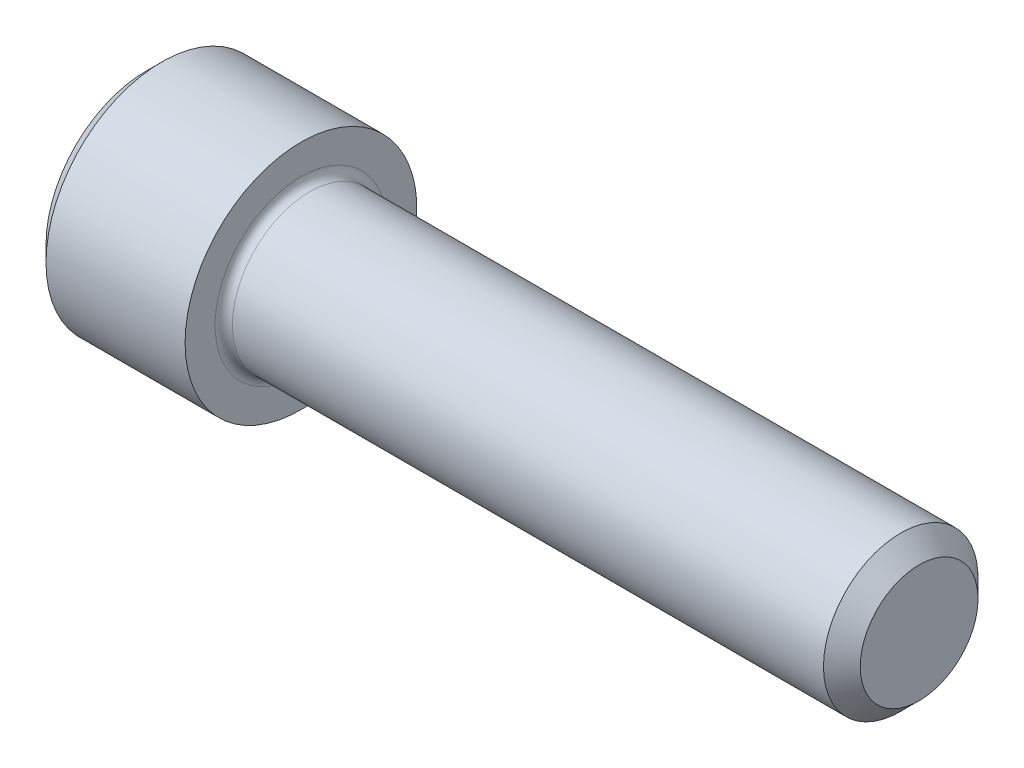
ISO-10303-21;
HEADER;
FILE_DESCRIPTION(('STEP AP214'),'2;1');
FILE_NAME('part.step','',(''),(''),'','','');
FILE_SCHEMA(('AUTOMOTIVE_DESIGN { 1 0 10303 214 1 1 1 1 }'));
ENDSEC;
DATA;
#1=APPLICATION_CONTEXT('core data for automotive mechanical design processes');
#2=APPLICATION_PROTOCOL_DEFINITION('international standard','automotive_design',2000,#1);
#3=PRODUCT_CONTEXT('',#1,'mechanical');
#4=PRODUCT('Part','Part','',(#3));
#5=PRODUCT_RELATED_PRODUCT_CATEGORY('part','',(#4));
#6=PRODUCT_DEFINITION_FORMATION('','',#4);
#7=PRODUCT_DEFINITION_CONTEXT('part definition',#1,'design');
#8=PRODUCT_DEFINITION('design','',#6,#7);
#9=PRODUCT_DEFINITION_SHAPE('','',#8);
#10=(LENGTH_UNIT() NAMED_UNIT(*) SI_UNIT(.MILLI.,.METRE.));
#11=(NAMED_UNIT(*) PLANE_ANGLE_UNIT() SI_UNIT($,.RADIAN.));
#12=(NAMED_UNIT(*) SI_UNIT($,.STERADIAN.) SOLID_ANGLE_UNIT());
#13=UNCERTAINTY_MEASURE_WITH_UNIT(LENGTH_MEASURE(1.E-05),#10,'distance_accuracy_value','');
#14=(GEOMETRIC_REPRESENTATION_CONTEXT(3) GLOBAL_UNCERTAINTY_ASSIGNED_CONTEXT((#13)) GLOBAL_UNIT_ASSIGNED_CONTEXT((#10,
#11,#12)) REPRESENTATION_CONTEXT('',''));
#15=CARTESIAN_POINT('',(0.,0.,0.));
#16=DIRECTION('',(0.,0.,1.));
#17=DIRECTION('',(1.,0.,0.));
#18=AXIS2_PLACEMENT_3D('',#15,#16,#17);
#19=CARTESIAN_POINT('',(0.,0.,0.));
#20=DIRECTION('',(-1.,0.,0.));
#21=DIRECTION('',(0.,0.,1.));
#22=AXIS2_PLACEMENT_3D('',#19,#20,#21);
#23=PLANE('',#22);
#24=DIRECTION('',(0.,-0.499999999999999,0.866025403784439));
#25=VECTOR('',#24,1.);
#26=CARTESIAN_POINT('',(0.,2.7496306570156,0.));
#27=LINE('',#26,#25);
#28=CARTESIAN_POINT('',(0.,2.7496306570156,0.));
#29=VERTEX_POINT('',#28);
#30=CARTESIAN_POINT('',(0.,1.3748153285078,2.38125));
#31=VERTEX_POINT('',#30);
#32=EDGE_CURVE('E387',#29,#31,#27,.T.);
#33=ORIENTED_EDGE('',*,*,#32,.T.);
#34=DIRECTION('',(0.,1.,0.));
#35=VECTOR('',#34,1.);
#36=CARTESIAN_POINT('',(0.,-1.37481532850779,2.38125));
#37=LINE('',#36,#35);
#38=CARTESIAN_POINT('',(0.,-1.37481532850779,2.38125));
#39=VERTEX_POINT('',#38);
#40=EDGE_CURVE('E131',#39,#31,#37,.T.);
#41=ORIENTED_EDGE('',*,*,#40,.F.);
#42=DIRECTION('',(0.,-0.500000000000001,-0.866025403784438));
#43=VECTOR('',#42,1.);
#44=CARTESIAN_POINT('',(0.,-1.37481532850779,2.38125));
#45=LINE('',#44,#43);
#46=CARTESIAN_POINT('',(0.,-2.74963065701559,0.));
#47=VERTEX_POINT('',#46);
#48=EDGE_CURVE('E390',#39,#47,#45,.T.);
#49=ORIENTED_EDGE('',*,*,#48,.T.);
#50=DIRECTION('',(0.,0.499999999999998,-0.86602540378444));
#51=VECTOR('',#50,1.);
#52=CARTESIAN_POINT('',(0.,-2.74963065701559,0.));
#53=LINE('',#52,#51);
#54=CARTESIAN_POINT('',(0.,-1.3748153285078,-2.38125));
#55=VERTEX_POINT('',#54);
#56=EDGE_CURVE('E393',#47,#55,#53,.T.);
#57=ORIENTED_EDGE('',*,*,#56,.T.);
#58=DIRECTION('',(0.,-1.,0.));
#59=VECTOR('',#58,1.);
#60=CARTESIAN_POINT('',(0.,1.3748153285078,-2.38125));
#61=LINE('',#60,#59);
#62=CARTESIAN_POINT('',(0.,1.3748153285078,-2.38125));
#63=VERTEX_POINT('',#62);
#64=EDGE_CURVE('E396',#63,#55,#61,.T.);
#65=ORIENTED_EDGE('',*,*,#64,.F.);
#66=DIRECTION('',(0.,-0.500000000000001,-0.866025403784438));
#67=VECTOR('',#66,1.);
#68=CARTESIAN_POINT('',(0.,2.7496306570156,0.));
#69=LINE('',#68,#67);
#70=EDGE_CURVE('E126',#29,#63,#69,.T.);
#71=ORIENTED_EDGE('',*,*,#70,.F.);
#72=EDGE_LOOP('',(#33,#41,#49,#57,#65,#71));
#73=FACE_BOUND('',#72,.T.);
#74=CARTESIAN_POINT('',(0.,0.,0.));
#75=DIRECTION('',(-1.,0.,0.));
#76=DIRECTION('',(0.,0.,1.));
#77=AXIS2_PLACEMENT_3D('',#74,#75,#76);
#78=CIRCLE('',#77,4.1275);
#79=CARTESIAN_POINT('',(0.,0.,4.1275));
#80=VERTEX_POINT('',#79);
#81=EDGE_CURVE('E142',#80,#80,#78,.T.);
#82=ORIENTED_EDGE('',*,*,#81,.T.);
#83=EDGE_LOOP('',(#82));
#84=FACE_BOUND('',#83,.T.);
#85=ADVANCED_FACE('F35',(#73,#84),#23,.T.);
#86=CARTESIAN_POINT('',(31.75,2.41935,0.));
#87=DIRECTION('',(1.,0.,0.));
#88=DIRECTION('',(0.,0.,-1.));
#89=AXIS2_PLACEMENT_3D('',#86,#87,#88);
#90=PLANE('',#89);
#91=CARTESIAN_POINT('',(31.75,0.,0.));
#92=DIRECTION('',(-1.,0.,0.));
#93=DIRECTION('',(0.,0.,1.));
#94=AXIS2_PLACEMENT_3D('',#91,#92,#93);
#95=CIRCLE('',#94,2.41935);
#96=CARTESIAN_POINT('',(31.75,0.,2.41935));
#97=VERTEX_POINT('',#96);
#98=EDGE_CURVE('E155',#97,#97,#95,.T.);
#99=ORIENTED_EDGE('',*,*,#98,.F.);
#100=EDGE_LOOP('',(#99));
#101=FACE_BOUND('',#100,.T.);
#102=ADVANCED_FACE('F176',(#101),#90,.T.);
#103=CARTESIAN_POINT('',(31.75,0.,0.));
#104=DIRECTION('',(-1.,0.,0.));
#105=DIRECTION('',(0.,0.,1.));
#106=AXIS2_PLACEMENT_3D('',#103,#104,#105);
#107=CONICAL_SURFACE('',#106,2.41935,0.785398163397218);
#108=CARTESIAN_POINT('',(30.9943499999998,0.,0.));
#109=DIRECTION('',(-1.,0.,0.));
#110=DIRECTION('',(0.,0.,1.));
#111=AXIS2_PLACEMENT_3D('',#108,#109,#110);
#112=CIRCLE('',#111,3.17499999999981);
#113=CARTESIAN_POINT('',(30.9943499999998,0.,3.17499999999981));
#114=VERTEX_POINT('',#113);
#115=EDGE_CURVE('E152',#114,#114,#112,.T.);
#116=ORIENTED_EDGE('',*,*,#115,.F.);
#117=EDGE_LOOP('',(#116));
#118=FACE_BOUND('',#117,.T.);
#119=ORIENTED_EDGE('',*,*,#98,.T.);
#120=EDGE_LOOP('',(#119));
#121=FACE_BOUND('',#120,.T.);
#122=ADVANCED_FACE('F182',(#118,#121),#107,.T.);
#123=CARTESIAN_POINT('',(-31.75,0.,0.));
#124=DIRECTION('',(-1.,0.,0.));
#125=DIRECTION('',(0.,0.,1.));
#126=AXIS2_PLACEMENT_3D('',#123,#124,#125);
#127=CYLINDRICAL_SURFACE('',#126,3.17499999999991);
#128=CARTESIAN_POINT('',(6.7056,0.,0.));
#129=DIRECTION('',(1.,0.,0.));
#130=DIRECTION('',(0.,0.,-1.));
#131=AXIS2_PLACEMENT_3D('',#128,#129,#130);
#132=CIRCLE('',#131,3.17499999999991);
#133=CARTESIAN_POINT('',(6.7056,0.,-3.17499999999991));
#134=VERTEX_POINT('',#133);
#135=EDGE_CURVE('E11',#134,#134,#132,.T.);
#136=ORIENTED_EDGE('',*,*,#135,.T.);
#137=EDGE_LOOP('',(#136));
#138=FACE_BOUND('',#137,.T.);
#139=ORIENTED_EDGE('',*,*,#115,.T.);
#140=EDGE_LOOP('',(#139));
#141=FACE_BOUND('',#140,.T.);
#142=ADVANCED_FACE('F193',(#138,#141),#127,.T.);
#143=CARTESIAN_POINT('',(6.35,4.7625,0.));
#144=DIRECTION('',(1.,0.,0.));
#145=DIRECTION('',(0.,0.,-1.));
#146=AXIS2_PLACEMENT_3D('',#143,#144,#145);
#147=PLANE('',#146);
#148=CARTESIAN_POINT('',(6.35,0.,0.));
#149=DIRECTION('',(1.,0.,0.));
#150=DIRECTION('',(0.,0.,-1.));
#151=AXIS2_PLACEMENT_3D('',#148,#149,#150);
#152=CIRCLE('',#151,3.53059999999991);
#153=CARTESIAN_POINT('',(6.35,0.,-3.53059999999991));
#154=VERTEX_POINT('',#153);
#155=EDGE_CURVE('E43',#154,#154,#152,.F.);
#156=ORIENTED_EDGE('',*,*,#155,.T.);
#157=EDGE_LOOP('',(#156));
#158=FACE_BOUND('',#157,.T.);
#159=CARTESIAN_POINT('',(6.35,0.,0.));
#160=DIRECTION('',(-1.,0.,0.));
#161=DIRECTION('',(0.,0.,1.));
#162=AXIS2_PLACEMENT_3D('',#159,#160,#161);
#163=CIRCLE('',#162,4.7625);
#164=CARTESIAN_POINT('',(6.35,0.,4.7625));
#165=VERTEX_POINT('',#164);
#166=EDGE_CURVE('E149',#165,#165,#163,.T.);
#167=ORIENTED_EDGE('',*,*,#166,.F.);
#168=EDGE_LOOP('',(#167));
#169=FACE_BOUND('',#168,.T.);
#170=ADVANCED_FACE('F160',(#158,#169),#147,.T.);
#171=CARTESIAN_POINT('',(-31.75,0.,0.));
#172=DIRECTION('',(-1.,0.,0.));
#173=DIRECTION('',(0.,0.,1.));
#174=AXIS2_PLACEMENT_3D('',#171,#172,#173);
#175=CYLINDRICAL_SURFACE('',#174,4.7625);
#176=ORIENTED_EDGE('',*,*,#166,.T.);
#177=EDGE_LOOP('',(#176));
#178=FACE_BOUND('',#177,.T.);
#179=CARTESIAN_POINT('',(0.634999999999997,0.,0.));
#180=DIRECTION('',(-1.,0.,0.));
#181=DIRECTION('',(0.,0.,1.));
#182=AXIS2_PLACEMENT_3D('',#179,#180,#181);
#183=CIRCLE('',#182,4.7625);
#184=CARTESIAN_POINT('',(0.634999999999997,0.,4.7625));
#185=VERTEX_POINT('',#184);
#186=EDGE_CURVE('E146',#185,#185,#183,.T.);
#187=ORIENTED_EDGE('',*,*,#186,.F.);
#188=EDGE_LOOP('',(#187));
#189=FACE_BOUND('',#188,.T.);
#190=ADVANCED_FACE('F171',(#178,#189),#175,.T.);
#191=CARTESIAN_POINT('',(0.,0.,0.));
#192=DIRECTION('',(1.,0.,0.));
#193=DIRECTION('',(0.,0.,-1.));
#194=AXIS2_PLACEMENT_3D('',#191,#192,#193);
#195=CONICAL_SURFACE('',#194,4.1275,0.785398163397449);
#196=ORIENTED_EDGE('',*,*,#186,.T.);
#197=EDGE_LOOP('',(#196));
#198=FACE_BOUND('',#197,.T.);
#199=ORIENTED_EDGE('',*,*,#81,.F.);
#200=EDGE_LOOP('',(#199));
#201=FACE_BOUND('',#200,.T.);
#202=ADVANCED_FACE('F164',(#198,#201),#195,.T.);
#203=CARTESIAN_POINT('',(6.7056,0.,0.));
#204=DIRECTION('',(1.,0.,0.));
#205=DIRECTION('',(0.,0.,-1.));
#206=AXIS2_PLACEMENT_3D('',#203,#204,#205);
#207=TOROIDAL_SURFACE('',#206,3.53059999999991,0.3556);
#208=ORIENTED_EDGE('',*,*,#135,.F.);
#209=EDGE_LOOP('',(#208));
#210=FACE_BOUND('',#209,.T.);
#211=ORIENTED_EDGE('',*,*,#155,.F.);
#212=EDGE_LOOP('',(#211));
#213=FACE_BOUND('',#212,.T.);
#214=ADVANCED_FACE('F37',(#210,#213),#207,.F.);
#215=CARTESIAN_POINT('',(3.048,2.7496306570156,0.));
#216=DIRECTION('',(0.,-0.866025403784439,-0.499999999999999));
#217=DIRECTION('',(0.,0.499999999999999,-0.866025403784439));
#218=AXIS2_PLACEMENT_3D('',#215,#216,#217);
#219=PLANE('',#218);
#220=ORIENTED_EDGE('',*,*,#32,.F.);
#221=DIRECTION('',(-1.,0.,0.));
#222=VECTOR('',#221,1.);
#223=CARTESIAN_POINT('',(3.048,2.7496306570156,0.));
#224=LINE('',#223,#222);
#225=CARTESIAN_POINT('',(3.048,2.7496306570156,0.));
#226=VERTEX_POINT('',#225);
#227=EDGE_CURVE('E377',#226,#29,#224,.T.);
#228=ORIENTED_EDGE('',*,*,#227,.F.);
#229=DIRECTION('',(0.,-0.499999999999999,0.866025403784439));
#230=VECTOR('',#229,1.);
#231=CARTESIAN_POINT('',(3.048,2.7496306570156,0.));
#232=LINE('',#231,#230);
#233=CARTESIAN_POINT('',(3.048,2.0622229927617,1.190625));
#234=VERTEX_POINT('',#233);
#235=EDGE_CURVE('E118',#226,#234,#232,.T.);
#236=ORIENTED_EDGE('',*,*,#235,.T.);
#237=CARTESIAN_POINT('',(3.048,1.3748153285078,2.38125));
#238=VERTEX_POINT('',#237);
#239=EDGE_CURVE('E109',#234,#238,#232,.T.);
#240=ORIENTED_EDGE('',*,*,#239,.T.);
#241=DIRECTION('',(-1.,0.,0.));
#242=VECTOR('',#241,1.);
#243=CARTESIAN_POINT('',(3.048,1.3748153285078,2.38125));
#244=LINE('',#243,#242);
#245=EDGE_CURVE('E123',#238,#31,#244,.T.);
#246=ORIENTED_EDGE('',*,*,#245,.T.);
#247=EDGE_LOOP('',(#220,#228,#236,#240,#246));
#248=FACE_BOUND('',#247,.T.);
#249=ADVANCED_FACE('F122',(#248),#219,.T.);
#250=CARTESIAN_POINT('',(3.048,-1.37481532850779,2.38125));
#251=DIRECTION('',(0.,0.,1.));
#252=DIRECTION('',(0.,-1.,0.));
#253=AXIS2_PLACEMENT_3D('',#250,#251,#252);
#254=PLANE('',#253);
#255=ORIENTED_EDGE('',*,*,#40,.T.);
#256=ORIENTED_EDGE('',*,*,#245,.F.);
#257=DIRECTION('',(0.,1.,0.));
#258=VECTOR('',#257,1.);
#259=CARTESIAN_POINT('',(3.048,-1.37481532850779,2.38125));
#260=LINE('',#259,#258);
#261=CARTESIAN_POINT('',(3.048,0.,2.38125));
#262=VERTEX_POINT('',#261);
#263=EDGE_CURVE('E106',#262,#238,#260,.T.);
#264=ORIENTED_EDGE('',*,*,#263,.F.);
#265=CARTESIAN_POINT('',(3.048,-1.37481532850779,2.38125));
#266=VERTEX_POINT('',#265);
#267=EDGE_CURVE('E117',#266,#262,#260,.T.);
#268=ORIENTED_EDGE('',*,*,#267,.F.);
#269=DIRECTION('',(-1.,0.,0.));
#270=VECTOR('',#269,1.);
#271=CARTESIAN_POINT('',(3.048,-1.37481532850779,2.38125));
#272=LINE('',#271,#270);
#273=EDGE_CURVE('E133',#266,#39,#272,.T.);
#274=ORIENTED_EDGE('',*,*,#273,.T.);
#275=EDGE_LOOP('',(#255,#256,#264,#268,#274));
#276=FACE_BOUND('',#275,.T.);
#277=ADVANCED_FACE('F128',(#276),#254,.F.);
#278=CARTESIAN_POINT('',(3.048,-1.37481532850779,2.38125));
#279=DIRECTION('',(0.,0.866025403784438,-0.500000000000001));
#280=DIRECTION('',(0.,0.500000000000001,0.866025403784438));
#281=AXIS2_PLACEMENT_3D('',#278,#279,#280);
#282=PLANE('',#281);
#283=ORIENTED_EDGE('',*,*,#48,.F.);
#284=ORIENTED_EDGE('',*,*,#273,.F.);
#285=DIRECTION('',(0.,-0.500000000000001,-0.866025403784438));
#286=VECTOR('',#285,1.);
#287=CARTESIAN_POINT('',(3.048,-1.37481532850779,2.38125));
#288=LINE('',#287,#286);
#289=CARTESIAN_POINT('',(3.048,-2.06222299276169,1.190625));
#290=VERTEX_POINT('',#289);
#291=EDGE_CURVE('E416',#266,#290,#288,.T.);
#292=ORIENTED_EDGE('',*,*,#291,.T.);
#293=CARTESIAN_POINT('',(3.048,-2.74963065701559,0.));
#294=VERTEX_POINT('',#293);
#295=EDGE_CURVE('E405',#290,#294,#288,.T.);
#296=ORIENTED_EDGE('',*,*,#295,.T.);
#297=DIRECTION('',(-1.,0.,0.));
#298=VECTOR('',#297,1.);
#299=CARTESIAN_POINT('',(3.048,-2.74963065701559,0.));
#300=LINE('',#299,#298);
#301=EDGE_CURVE('E138',#294,#47,#300,.T.);
#302=ORIENTED_EDGE('',*,*,#301,.T.);
#303=EDGE_LOOP('',(#283,#284,#292,#296,#302));
#304=FACE_BOUND('',#303,.T.);
#305=ADVANCED_FACE('F268',(#304),#282,.T.);
#306=CARTESIAN_POINT('',(3.048,-2.74963065701559,0.));
#307=DIRECTION('',(0.,0.86602540378444,0.499999999999998));
#308=DIRECTION('',(0.,-0.499999999999998,0.86602540378444));
#309=AXIS2_PLACEMENT_3D('',#306,#307,#308);
#310=PLANE('',#309);
#311=ORIENTED_EDGE('',*,*,#56,.F.);
#312=ORIENTED_EDGE('',*,*,#301,.F.);
#313=DIRECTION('',(0.,0.499999999999998,-0.86602540378444));
#314=VECTOR('',#313,1.);
#315=CARTESIAN_POINT('',(3.048,-2.74963065701559,0.));
#316=LINE('',#315,#314);
#317=CARTESIAN_POINT('',(3.048,-2.06222299276169,-1.19062499999999));
#318=VERTEX_POINT('',#317);
#319=EDGE_CURVE('E383',#294,#318,#316,.T.);
#320=ORIENTED_EDGE('',*,*,#319,.T.);
#321=CARTESIAN_POINT('',(3.048,-1.3748153285078,-2.38125));
#322=VERTEX_POINT('',#321);
#323=EDGE_CURVE('E415',#318,#322,#316,.T.);
#324=ORIENTED_EDGE('',*,*,#323,.T.);
#325=DIRECTION('',(-1.,0.,0.));
#326=VECTOR('',#325,1.);
#327=CARTESIAN_POINT('',(3.048,-1.3748153285078,-2.38125));
#328=LINE('',#327,#326);
#329=EDGE_CURVE('E376',#322,#55,#328,.T.);
#330=ORIENTED_EDGE('',*,*,#329,.T.);
#331=EDGE_LOOP('',(#311,#312,#320,#324,#330));
#332=FACE_BOUND('',#331,.T.);
#333=ADVANCED_FACE('F276',(#332),#310,.T.);
#334=CARTESIAN_POINT('',(3.048,1.3748153285078,-2.38125));
#335=DIRECTION('',(0.,0.,-1.));
#336=DIRECTION('',(0.,1.,0.));
#337=AXIS2_PLACEMENT_3D('',#334,#335,#336);
#338=PLANE('',#337);
#339=ORIENTED_EDGE('',*,*,#64,.T.);
#340=ORIENTED_EDGE('',*,*,#329,.F.);
#341=DIRECTION('',(0.,-1.,0.));
#342=VECTOR('',#341,1.);
#343=CARTESIAN_POINT('',(3.048,1.3748153285078,-2.38125));
#344=LINE('',#343,#342);
#345=CARTESIAN_POINT('',(3.048,0.,-2.38125));
#346=VERTEX_POINT('',#345);
#347=EDGE_CURVE('E380',#346,#322,#344,.T.);
#348=ORIENTED_EDGE('',*,*,#347,.F.);
#349=CARTESIAN_POINT('',(3.048,1.3748153285078,-2.38125));
#350=VERTEX_POINT('',#349);
#351=EDGE_CURVE('E50',#350,#346,#344,.T.);
#352=ORIENTED_EDGE('',*,*,#351,.F.);
#353=DIRECTION('',(-1.,0.,0.));
#354=VECTOR('',#353,1.);
#355=CARTESIAN_POINT('',(3.048,1.3748153285078,-2.38125));
#356=LINE('',#355,#354);
#357=EDGE_CURVE('E373',#350,#63,#356,.T.);
#358=ORIENTED_EDGE('',*,*,#357,.T.);
#359=EDGE_LOOP('',(#339,#340,#348,#352,#358));
#360=FACE_BOUND('',#359,.T.);
#361=ADVANCED_FACE('F285',(#360),#338,.F.);
#362=CARTESIAN_POINT('',(3.048,2.7496306570156,0.));
#363=DIRECTION('',(0.,0.866025403784438,-0.500000000000001));
#364=DIRECTION('',(0.,0.500000000000001,0.866025403784438));
#365=AXIS2_PLACEMENT_3D('',#362,#363,#364);
#366=PLANE('',#365);
#367=ORIENTED_EDGE('',*,*,#70,.T.);
#368=ORIENTED_EDGE('',*,*,#357,.F.);
#369=DIRECTION('',(0.,-0.500000000000001,-0.866025403784438));
#370=VECTOR('',#369,1.);
#371=CARTESIAN_POINT('',(3.048,2.7496306570156,0.));
#372=LINE('',#371,#370);
#373=CARTESIAN_POINT('',(3.048,2.0622229927617,-1.19062500000001));
#374=VERTEX_POINT('',#373);
#375=EDGE_CURVE('E363',#374,#350,#372,.T.);
#376=ORIENTED_EDGE('',*,*,#375,.F.);
#377=EDGE_CURVE('E369',#226,#374,#372,.T.);
#378=ORIENTED_EDGE('',*,*,#377,.F.);
#379=ORIENTED_EDGE('',*,*,#227,.T.);
#380=EDGE_LOOP('',(#367,#368,#376,#378,#379));
#381=FACE_BOUND('',#380,.T.);
#382=ADVANCED_FACE('F294',(#381),#366,.F.);
#383=CARTESIAN_POINT('',(3.048,4.12444598552339,-2.38125000000001));
#384=DIRECTION('',(1.,0.,0.));
#385=DIRECTION('',(0.,0.,-1.));
#386=AXIS2_PLACEMENT_3D('',#383,#384,#385);
#387=PLANE('',#386);
#388=ORIENTED_EDGE('',*,*,#347,.T.);
#389=ORIENTED_EDGE('',*,*,#323,.F.);
#390=CARTESIAN_POINT('',(3.048,0.,0.));
#391=DIRECTION('',(-1.,0.,0.));
#392=DIRECTION('',(0.,0.,1.));
#393=AXIS2_PLACEMENT_3D('',#390,#391,#392);
#394=CIRCLE('',#393,2.38125);
#395=EDGE_CURVE('E411',#346,#318,#394,.T.);
#396=ORIENTED_EDGE('',*,*,#395,.F.);
#397=EDGE_LOOP('',(#388,#389,#396));
#398=FACE_BOUND('',#397,.T.);
#399=ADVANCED_FACE('F303',(#398),#387,.F.);
#400=ORIENTED_EDGE('',*,*,#319,.F.);
#401=ORIENTED_EDGE('',*,*,#295,.F.);
#402=EDGE_CURVE('E136',#318,#290,#394,.T.);
#403=ORIENTED_EDGE('',*,*,#402,.F.);
#404=EDGE_LOOP('',(#400,#401,#403));
#405=FACE_BOUND('',#404,.T.);
#406=ADVANCED_FACE('F312',(#405),#387,.F.);
#407=ORIENTED_EDGE('',*,*,#291,.F.);
#408=ORIENTED_EDGE('',*,*,#267,.T.);
#409=EDGE_CURVE('E132',#290,#262,#394,.T.);
#410=ORIENTED_EDGE('',*,*,#409,.F.);
#411=EDGE_LOOP('',(#407,#408,#410));
#412=FACE_BOUND('',#411,.T.);
#413=ADVANCED_FACE('F321',(#412),#387,.F.);
#414=ORIENTED_EDGE('',*,*,#263,.T.);
#415=ORIENTED_EDGE('',*,*,#239,.F.);
#416=EDGE_CURVE('E112',#262,#234,#394,.T.);
#417=ORIENTED_EDGE('',*,*,#416,.F.);
#418=EDGE_LOOP('',(#414,#415,#417));
#419=FACE_BOUND('',#418,.T.);
#420=ADVANCED_FACE('F108',(#419),#387,.F.);
#421=ORIENTED_EDGE('',*,*,#235,.F.);
#422=ORIENTED_EDGE('',*,*,#377,.T.);
#423=EDGE_CURVE('E143',#234,#374,#394,.T.);
#424=ORIENTED_EDGE('',*,*,#423,.F.);
#425=EDGE_LOOP('',(#421,#422,#424));
#426=FACE_BOUND('',#425,.T.);
#427=ADVANCED_FACE('F336',(#426),#387,.F.);
#428=ORIENTED_EDGE('',*,*,#375,.T.);
#429=ORIENTED_EDGE('',*,*,#351,.T.);
#430=EDGE_CURVE('E366',#374,#346,#394,.T.);
#431=ORIENTED_EDGE('',*,*,#430,.F.);
#432=EDGE_LOOP('',(#428,#429,#431));
#433=FACE_BOUND('',#432,.T.);
#434=ADVANCED_FACE('F251',(#433),#387,.F.);
#435=CARTESIAN_POINT('',(3.048,0.,0.));
#436=DIRECTION('',(-1.,0.,0.));
#437=DIRECTION('',(0.,0.,1.));
#438=AXIS2_PLACEMENT_3D('',#435,#436,#437);
#439=CONICAL_SURFACE('',#438,2.38125,1.04719755119659);
#440=CARTESIAN_POINT('',(4.42281532850781,0.,0.));
#441=VERTEX_POINT('',#440);
#442=VERTEX_LOOP('',#441);
#443=FACE_BOUND('',#442,.T.);
#444=ORIENTED_EDGE('',*,*,#416,.T.);
#445=ORIENTED_EDGE('',*,*,#423,.T.);
#446=ORIENTED_EDGE('',*,*,#430,.T.);
#447=ORIENTED_EDGE('',*,*,#395,.T.);
#448=ORIENTED_EDGE('',*,*,#402,.T.);
#449=ORIENTED_EDGE('',*,*,#409,.T.);
#450=EDGE_LOOP('',(#444,#445,#446,#447,#448,#449));
#451=FACE_BOUND('',#450,.T.);
#452=ADVANCED_FACE('F186',(#443,#451),#439,.F.);
#453=CLOSED_SHELL('',(#85,#102,#122,#142,#170,#190,#202,#214,#249,#277,#305,#333,#361,#382,#399,
#406,#413,#420,#427,#434,#452));
#454=MANIFOLD_SOLID_BREP('B2',#453);
#455=ADVANCED_BREP_SHAPE_REPRESENTATION('',(#18,#454),#14);
#456=SHAPE_DEFINITION_REPRESENTATION(#9,#455);
ENDSEC;
END-ISO-10303-21;
